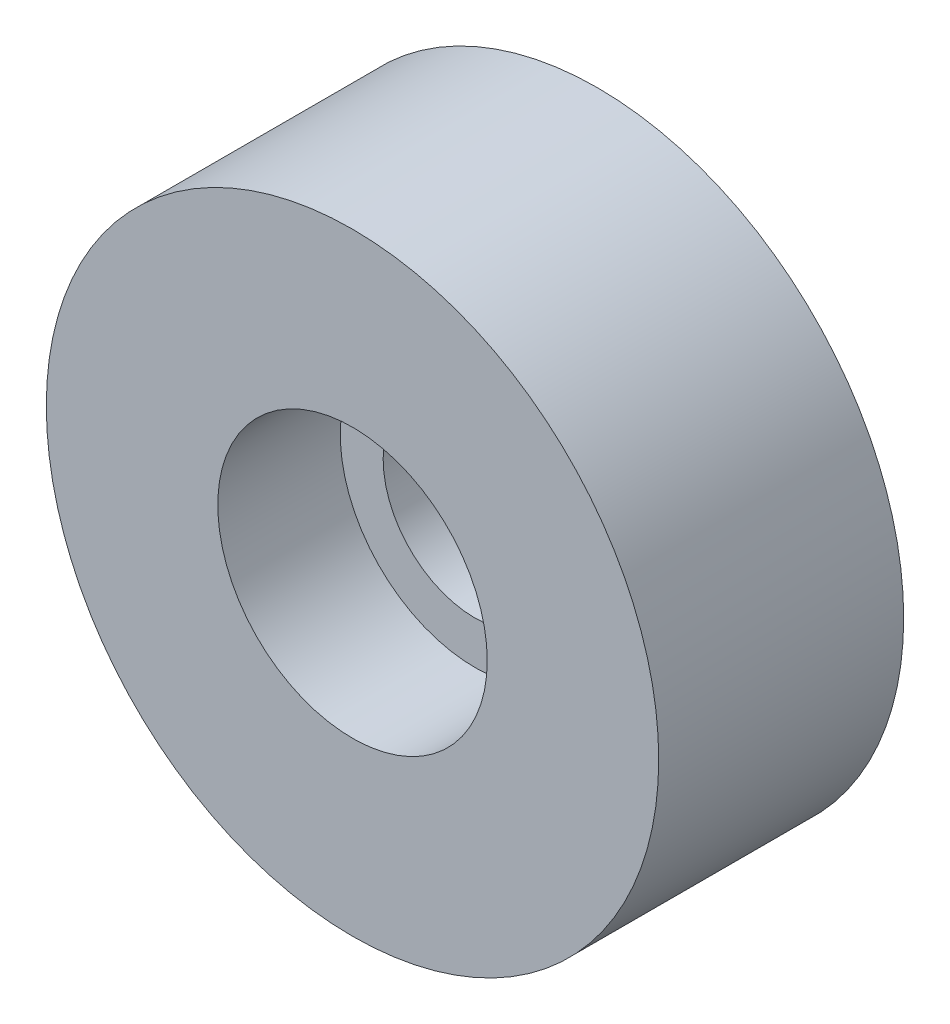
ISO-10303-21;
HEADER;
FILE_DESCRIPTION(('STEP AP214'),'2;1');
FILE_NAME('part.step','',(''),(''),'','','');
FILE_SCHEMA(('AUTOMOTIVE_DESIGN { 1 0 10303 214 1 1 1 1 }'));
ENDSEC;
DATA;
#1=APPLICATION_CONTEXT('core data for automotive mechanical design processes');
#2=APPLICATION_PROTOCOL_DEFINITION('international standard','automotive_design',2000,#1);
#3=PRODUCT_CONTEXT('',#1,'mechanical');
#4=PRODUCT('Part','Part','',(#3));
#5=PRODUCT_RELATED_PRODUCT_CATEGORY('part','',(#4));
#6=PRODUCT_DEFINITION_FORMATION('','',#4);
#7=PRODUCT_DEFINITION_CONTEXT('part definition',#1,'design');
#8=PRODUCT_DEFINITION('design','',#6,#7);
#9=PRODUCT_DEFINITION_SHAPE('','',#8);
#10=(LENGTH_UNIT() NAMED_UNIT(*) SI_UNIT(.MILLI.,.METRE.));
#11=(NAMED_UNIT(*) PLANE_ANGLE_UNIT() SI_UNIT($,.RADIAN.));
#12=(NAMED_UNIT(*) SI_UNIT($,.STERADIAN.) SOLID_ANGLE_UNIT());
#13=UNCERTAINTY_MEASURE_WITH_UNIT(LENGTH_MEASURE(1.E-05),#10,'distance_accuracy_value','');
#14=(GEOMETRIC_REPRESENTATION_CONTEXT(3) GLOBAL_UNCERTAINTY_ASSIGNED_CONTEXT((#13)) GLOBAL_UNIT_ASSIGNED_CONTEXT((#10,
#11,#12)) REPRESENTATION_CONTEXT('',''));
#15=CARTESIAN_POINT('',(0.,0.,0.));
#16=DIRECTION('',(0.,0.,1.));
#17=DIRECTION('',(1.,0.,0.));
#18=AXIS2_PLACEMENT_3D('',#15,#16,#17);
#19=CARTESIAN_POINT('',(0.,0.,4.));
#20=DIRECTION('',(0.,0.,-1.));
#21=DIRECTION('',(-1.,0.,0.));
#22=AXIS2_PLACEMENT_3D('',#19,#20,#21);
#23=CYLINDRICAL_SURFACE('',#22,5.);
#24=CARTESIAN_POINT('',(0.,0.,4.));
#25=DIRECTION('',(0.,0.,1.));
#26=DIRECTION('',(1.,0.,0.));
#27=AXIS2_PLACEMENT_3D('',#24,#25,#26);
#28=CIRCLE('',#27,5.);
#29=CARTESIAN_POINT('',(5.,0.,4.));
#30=VERTEX_POINT('',#29);
#31=EDGE_CURVE('E10',#30,#30,#28,.T.);
#32=ORIENTED_EDGE('',*,*,#31,.F.);
#33=EDGE_LOOP('',(#32));
#34=FACE_BOUND('',#33,.T.);
#35=CARTESIAN_POINT('',(0.,0.,0.));
#36=DIRECTION('',(0.,0.,1.));
#37=DIRECTION('',(1.,0.,0.));
#38=AXIS2_PLACEMENT_3D('',#35,#36,#37);
#39=CIRCLE('',#38,5.);
#40=CARTESIAN_POINT('',(5.,0.,0.));
#41=VERTEX_POINT('',#40);
#42=EDGE_CURVE('E38',#41,#41,#39,.T.);
#43=ORIENTED_EDGE('',*,*,#42,.T.);
#44=EDGE_LOOP('',(#43));
#45=FACE_BOUND('',#44,.T.);
#46=ADVANCED_FACE('F31',(#34,#45),#23,.T.);
#47=CARTESIAN_POINT('',(0.,0.,4.));
#48=DIRECTION('',(0.,0.,1.));
#49=DIRECTION('',(1.,0.,0.));
#50=AXIS2_PLACEMENT_3D('',#47,#48,#49);
#51=PLANE('',#50);
#52=CARTESIAN_POINT('',(0.,0.,4.));
#53=DIRECTION('',(0.,0.,1.));
#54=DIRECTION('',(1.,0.,0.));
#55=AXIS2_PLACEMENT_3D('',#52,#53,#54);
#56=CIRCLE('',#55,2.2);
#57=CARTESIAN_POINT('',(2.2,0.,4.));
#58=VERTEX_POINT('',#57);
#59=EDGE_CURVE('E45',#58,#58,#56,.T.);
#60=ORIENTED_EDGE('',*,*,#59,.F.);
#61=EDGE_LOOP('',(#60));
#62=FACE_BOUND('',#61,.T.);
#63=ORIENTED_EDGE('',*,*,#31,.T.);
#64=EDGE_LOOP('',(#63));
#65=FACE_BOUND('',#64,.T.);
#66=ADVANCED_FACE('F72',(#62,#65),#51,.T.);
#67=CARTESIAN_POINT('',(0.,0.,0.));
#68=DIRECTION('',(0.,0.,1.));
#69=DIRECTION('',(1.,0.,0.));
#70=AXIS2_PLACEMENT_3D('',#67,#68,#69);
#71=PLANE('',#70);
#72=CARTESIAN_POINT('',(0.,0.,0.));
#73=DIRECTION('',(0.,0.,-1.));
#74=DIRECTION('',(-1.,0.,0.));
#75=AXIS2_PLACEMENT_3D('',#72,#73,#74);
#76=CIRCLE('',#75,1.5);
#77=CARTESIAN_POINT('',(-1.5,0.,0.));
#78=VERTEX_POINT('',#77);
#79=EDGE_CURVE('E50',#78,#78,#76,.T.);
#80=ORIENTED_EDGE('',*,*,#79,.F.);
#81=EDGE_LOOP('',(#80));
#82=FACE_BOUND('',#81,.T.);
#83=ORIENTED_EDGE('',*,*,#42,.F.);
#84=EDGE_LOOP('',(#83));
#85=FACE_BOUND('',#84,.T.);
#86=ADVANCED_FACE('F68',(#82,#85),#71,.F.);
#87=CARTESIAN_POINT('',(0.,0.,2.));
#88=DIRECTION('',(0.,0.,1.));
#89=DIRECTION('',(1.,0.,0.));
#90=AXIS2_PLACEMENT_3D('',#87,#88,#89);
#91=CYLINDRICAL_SURFACE('',#90,2.2);
#92=CARTESIAN_POINT('',(0.,0.,2.));
#93=DIRECTION('',(0.,0.,1.));
#94=DIRECTION('',(1.,0.,0.));
#95=AXIS2_PLACEMENT_3D('',#92,#93,#94);
#96=CIRCLE('',#95,2.2);
#97=CARTESIAN_POINT('',(2.2,0.,2.));
#98=VERTEX_POINT('',#97);
#99=EDGE_CURVE('E43',#98,#98,#96,.T.);
#100=ORIENTED_EDGE('',*,*,#99,.F.);
#101=EDGE_LOOP('',(#100));
#102=FACE_BOUND('',#101,.T.);
#103=ORIENTED_EDGE('',*,*,#59,.T.);
#104=EDGE_LOOP('',(#103));
#105=FACE_BOUND('',#104,.T.);
#106=ADVANCED_FACE('F62',(#102,#105),#91,.F.);
#107=CARTESIAN_POINT('',(0.,0.,2.));
#108=DIRECTION('',(0.,0.,1.));
#109=DIRECTION('',(1.,0.,0.));
#110=AXIS2_PLACEMENT_3D('',#107,#108,#109);
#111=PLANE('',#110);
#112=CARTESIAN_POINT('',(0.,0.,2.));
#113=DIRECTION('',(0.,0.,1.));
#114=DIRECTION('',(1.,0.,0.));
#115=AXIS2_PLACEMENT_3D('',#112,#113,#114);
#116=CIRCLE('',#115,1.5);
#117=CARTESIAN_POINT('',(1.5,0.,2.));
#118=VERTEX_POINT('',#117);
#119=EDGE_CURVE('E34',#118,#118,#116,.T.);
#120=ORIENTED_EDGE('',*,*,#119,.F.);
#121=EDGE_LOOP('',(#120));
#122=FACE_BOUND('',#121,.T.);
#123=ORIENTED_EDGE('',*,*,#99,.T.);
#124=EDGE_LOOP('',(#123));
#125=FACE_BOUND('',#124,.T.);
#126=ADVANCED_FACE('F59',(#122,#125),#111,.T.);
#127=CARTESIAN_POINT('',(0.,0.,4.));
#128=DIRECTION('',(0.,0.,-1.));
#129=DIRECTION('',(-1.,0.,0.));
#130=AXIS2_PLACEMENT_3D('',#127,#128,#129);
#131=CYLINDRICAL_SURFACE('',#130,1.5);
#132=ORIENTED_EDGE('',*,*,#119,.T.);
#133=EDGE_LOOP('',(#132));
#134=FACE_BOUND('',#133,.T.);
#135=ORIENTED_EDGE('',*,*,#79,.T.);
#136=EDGE_LOOP('',(#135));
#137=FACE_BOUND('',#136,.T.);
#138=ADVANCED_FACE('F57',(#134,#137),#131,.F.);
#139=CLOSED_SHELL('',(#46,#66,#86,#106,#126,#138));
#140=MANIFOLD_SOLID_BREP('B2',#139);
#141=ADVANCED_BREP_SHAPE_REPRESENTATION('',(#18,#140),#14);
#142=SHAPE_DEFINITION_REPRESENTATION(#9,#141);
ENDSEC;
END-ISO-10303-21;
